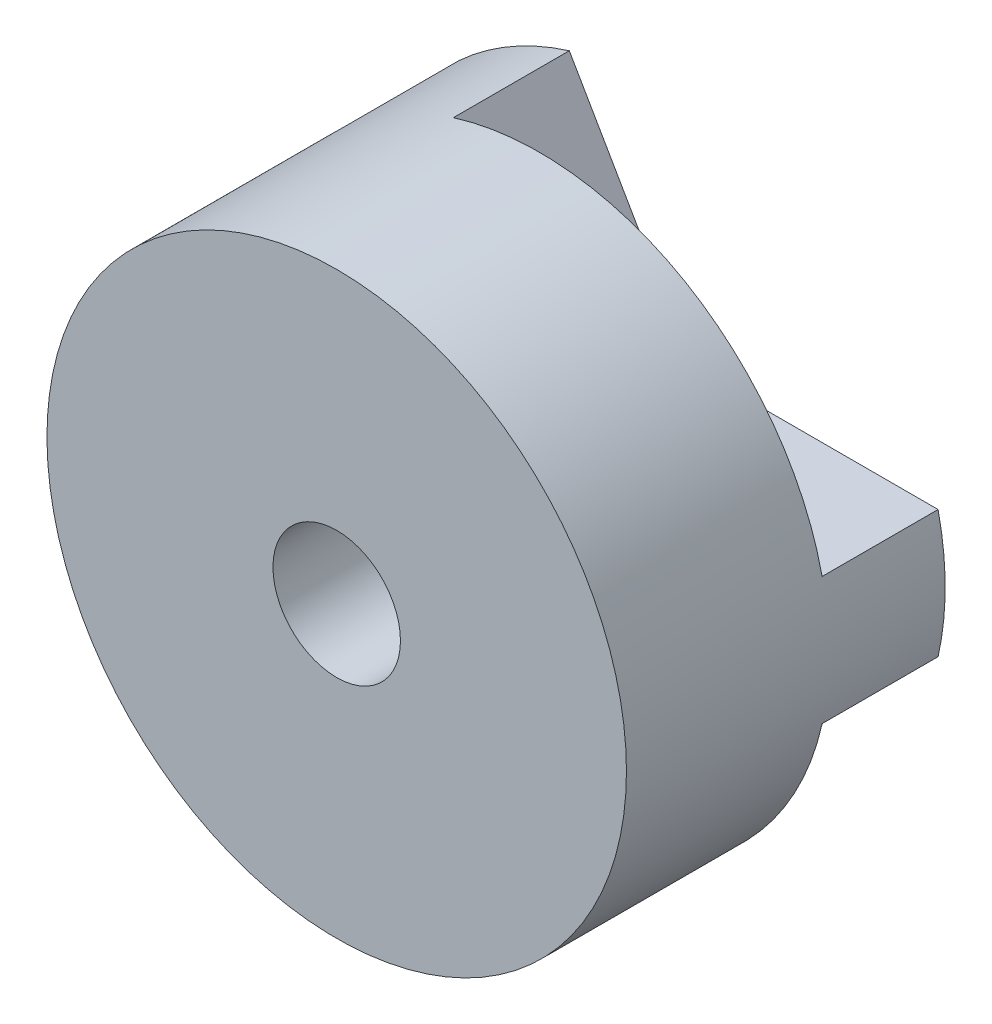
ISO-10303-21;
HEADER;
FILE_DESCRIPTION(('STEP AP214'),'2;1');
FILE_NAME('part.step','',(''),(''),'','','');
FILE_SCHEMA(('AUTOMOTIVE_DESIGN { 1 0 10303 214 1 1 1 1 }'));
ENDSEC;
DATA;
#1=APPLICATION_CONTEXT('core data for automotive mechanical design processes');
#2=APPLICATION_PROTOCOL_DEFINITION('international standard','automotive_design',2000,#1);
#3=PRODUCT_CONTEXT('',#1,'mechanical');
#4=PRODUCT('Part','Part','',(#3));
#5=PRODUCT_RELATED_PRODUCT_CATEGORY('part','',(#4));
#6=PRODUCT_DEFINITION_FORMATION('','',#4);
#7=PRODUCT_DEFINITION_CONTEXT('part definition',#1,'design');
#8=PRODUCT_DEFINITION('design','',#6,#7);
#9=PRODUCT_DEFINITION_SHAPE('','',#8);
#10=(LENGTH_UNIT() NAMED_UNIT(*) SI_UNIT(.MILLI.,.METRE.));
#11=(NAMED_UNIT(*) PLANE_ANGLE_UNIT() SI_UNIT($,.RADIAN.));
#12=(NAMED_UNIT(*) SI_UNIT($,.STERADIAN.) SOLID_ANGLE_UNIT());
#13=UNCERTAINTY_MEASURE_WITH_UNIT(LENGTH_MEASURE(1.E-05),#10,'distance_accuracy_value','');
#14=(GEOMETRIC_REPRESENTATION_CONTEXT(3) GLOBAL_UNCERTAINTY_ASSIGNED_CONTEXT((#13)) GLOBAL_UNIT_ASSIGNED_CONTEXT((#10,
#11,#12)) REPRESENTATION_CONTEXT('',''));
#15=CARTESIAN_POINT('',(0.,0.,0.));
#16=DIRECTION('',(0.,0.,1.));
#17=DIRECTION('',(1.,0.,0.));
#18=AXIS2_PLACEMENT_3D('',#15,#16,#17);
#19=CARTESIAN_POINT('',(0.,0.,0.));
#20=DIRECTION('',(0.,0.,1.));
#21=DIRECTION('',(1.,0.,0.));
#22=AXIS2_PLACEMENT_3D('',#19,#20,#21);
#23=PLANE('',#22);
#24=CARTESIAN_POINT('',(0.,0.,0.));
#25=DIRECTION('',(0.,0.,1.));
#26=DIRECTION('',(1.,0.,0.));
#27=AXIS2_PLACEMENT_3D('',#24,#25,#26);
#28=CIRCLE('',#27,50.);
#29=CARTESIAN_POINT('',(-33.913776238143,-36.7403835209864,0.));
#30=VERTEX_POINT('',#29);
#31=CARTESIAN_POINT('',(-14.8612173548839,-47.7403835209867,0.));
#32=VERTEX_POINT('',#31);
#33=EDGE_CURVE('E155',#30,#32,#28,.T.);
#34=ORIENTED_EDGE('',*,*,#33,.F.);
#35=DIRECTION('',(-0.499999999999983,-0.866025403784448,0.));
#36=VECTOR('',#35,1.);
#37=CARTESIAN_POINT('',(-33.913776238143,-36.7403835209864,0.));
#38=LINE('',#37,#36);
#39=CARTESIAN_POINT('',(-18.0990171775731,-9.34841731861795,0.));
#40=VERTEX_POINT('',#39);
#41=EDGE_CURVE('E100',#40,#30,#38,.T.);
#42=ORIENTED_EDGE('',*,*,#41,.F.);
#43=CARTESIAN_POINT('',(0.,0.,0.));
#44=DIRECTION('',(0.,0.,-1.));
#45=DIRECTION('',(-1.,0.,0.));
#46=AXIS2_PLACEMENT_3D('',#43,#44,#45);
#47=CIRCLE('',#46,20.3707468973801);
#48=CARTESIAN_POINT('',(0.953541705686563,-20.3484173186181,0.));
#49=VERTEX_POINT('',#48);
#50=EDGE_CURVE('E213',#49,#40,#47,.T.);
#51=ORIENTED_EDGE('',*,*,#50,.F.);
#52=DIRECTION('',(0.499999999999995,0.866025403784442,0.));
#53=VECTOR('',#52,1.);
#54=CARTESIAN_POINT('',(-14.8612173548839,-47.7403835209867,0.));
#55=LINE('',#54,#53);
#56=EDGE_CURVE('E211',#32,#49,#55,.T.);
#57=ORIENTED_EDGE('',*,*,#56,.F.);
#58=EDGE_LOOP('',(#34,#42,#51,#57));
#59=FACE_BOUND('',#58,.T.);
#60=ADVANCED_FACE('F32',(#59),#23,.F.);
#61=CARTESIAN_POINT('',(48.7749935930288,-11.0000000000001,0.));
#62=VERTEX_POINT('',#61);
#63=CARTESIAN_POINT('',(48.7749935930285,11.0000000000015,0.));
#64=VERTEX_POINT('',#63);
#65=EDGE_CURVE('E179',#62,#64,#28,.T.);
#66=ORIENTED_EDGE('',*,*,#65,.F.);
#67=DIRECTION('',(1.,0.,0.));
#68=VECTOR('',#67,1.);
#69=CARTESIAN_POINT('',(48.7749935930288,-11.0000000000001,0.));
#70=LINE('',#69,#68);
#71=CARTESIAN_POINT('',(17.145475471888,-11.0000000000004,0.));
#72=VERTEX_POINT('',#71);
#73=EDGE_CURVE('E209',#72,#62,#70,.T.);
#74=ORIENTED_EDGE('',*,*,#73,.F.);
#75=CARTESIAN_POINT('',(0.,0.,0.));
#76=DIRECTION('',(0.,0.,-1.));
#77=DIRECTION('',(-1.,0.,0.));
#78=AXIS2_PLACEMENT_3D('',#75,#76,#77);
#79=CIRCLE('',#78,20.3707468973801);
#80=CARTESIAN_POINT('',(17.1454754718873,11.0000000000015,0.));
#81=VERTEX_POINT('',#80);
#82=EDGE_CURVE('E206',#81,#72,#79,.T.);
#83=ORIENTED_EDGE('',*,*,#82,.F.);
#84=DIRECTION('',(-1.,0.,0.));
#85=VECTOR('',#84,1.);
#86=CARTESIAN_POINT('',(48.7749935930285,11.0000000000015,0.));
#87=LINE('',#86,#85);
#88=EDGE_CURVE('E203',#64,#81,#87,.T.);
#89=ORIENTED_EDGE('',*,*,#88,.F.);
#90=EDGE_LOOP('',(#66,#74,#83,#89));
#91=FACE_BOUND('',#90,.T.);
#92=ADVANCED_FACE('F223',(#91),#23,.F.);
#93=CARTESIAN_POINT('',(0.,0.,55.));
#94=DIRECTION('',(0.,0.,-1.));
#95=DIRECTION('',(-1.,0.,0.));
#96=AXIS2_PLACEMENT_3D('',#93,#94,#95);
#97=CYLINDRICAL_SURFACE('',#96,11.);
#98=CARTESIAN_POINT('',(0.,0.,55.));
#99=DIRECTION('',(0.,0.,1.));
#100=DIRECTION('',(1.,0.,0.));
#101=AXIS2_PLACEMENT_3D('',#98,#99,#100);
#102=CIRCLE('',#101,11.);
#103=CARTESIAN_POINT('',(11.,0.,55.));
#104=VERTEX_POINT('',#103);
#105=EDGE_CURVE('E177',#104,#104,#102,.T.);
#106=ORIENTED_EDGE('',*,*,#105,.T.);
#107=EDGE_LOOP('',(#106));
#108=FACE_BOUND('',#107,.T.);
#109=CARTESIAN_POINT('',(0.,0.,20.));
#110=DIRECTION('',(0.,0.,-1.));
#111=DIRECTION('',(-1.,0.,0.));
#112=AXIS2_PLACEMENT_3D('',#109,#110,#111);
#113=CIRCLE('',#112,11.);
#114=CARTESIAN_POINT('',(-11.,0.,20.));
#115=VERTEX_POINT('',#114);
#116=EDGE_CURVE('E36',#115,#115,#113,.T.);
#117=ORIENTED_EDGE('',*,*,#116,.T.);
#118=EDGE_LOOP('',(#117));
#119=FACE_BOUND('',#118,.T.);
#120=ADVANCED_FACE('F227',(#108,#119),#97,.F.);
#121=CARTESIAN_POINT('',(0.,0.,55.));
#122=DIRECTION('',(0.,0.,1.));
#123=DIRECTION('',(1.,0.,0.));
#124=AXIS2_PLACEMENT_3D('',#121,#122,#123);
#125=PLANE('',#124);
#126=CARTESIAN_POINT('',(0.,0.,55.));
#127=DIRECTION('',(0.,0.,1.));
#128=DIRECTION('',(1.,0.,0.));
#129=AXIS2_PLACEMENT_3D('',#126,#127,#128);
#130=CIRCLE('',#129,50.);
#131=CARTESIAN_POINT('',(50.,0.,55.));
#132=VERTEX_POINT('',#131);
#133=EDGE_CURVE('E11',#132,#132,#130,.T.);
#134=ORIENTED_EDGE('',*,*,#133,.T.);
#135=EDGE_LOOP('',(#134));
#136=FACE_BOUND('',#135,.T.);
#137=ORIENTED_EDGE('',*,*,#105,.F.);
#138=EDGE_LOOP('',(#137));
#139=FACE_BOUND('',#138,.T.);
#140=ADVANCED_FACE('F231',(#136,#139),#125,.T.);
#141=CARTESIAN_POINT('',(-14.8612173548857,47.7403835209861,0.));
#142=VERTEX_POINT('',#141);
#143=CARTESIAN_POINT('',(-33.9137762381444,36.7403835209851,0.));
#144=VERTEX_POINT('',#143);
#145=EDGE_CURVE('E41',#142,#144,#28,.T.);
#146=ORIENTED_EDGE('',*,*,#145,.F.);
#147=DIRECTION('',(-0.500000000000012,0.866025403784431,0.));
#148=VECTOR('',#147,1.);
#149=CARTESIAN_POINT('',(-14.8612173548857,47.7403835209861,0.));
#150=LINE('',#149,#148);
#151=CARTESIAN_POINT('',(0.953541705685063,20.3484173186182,0.));
#152=VERTEX_POINT('',#151);
#153=EDGE_CURVE('E192',#152,#142,#150,.T.);
#154=ORIENTED_EDGE('',*,*,#153,.F.);
#155=CARTESIAN_POINT('',(0.,0.,0.));
#156=DIRECTION('',(0.,0.,-1.));
#157=DIRECTION('',(-1.,0.,0.));
#158=AXIS2_PLACEMENT_3D('',#155,#156,#157);
#159=CIRCLE('',#158,20.3707468973801);
#160=CARTESIAN_POINT('',(-18.0990171775738,9.34841731861664,0.));
#161=VERTEX_POINT('',#160);
#162=EDGE_CURVE('E196',#161,#152,#159,.T.);
#163=ORIENTED_EDGE('',*,*,#162,.F.);
#164=DIRECTION('',(0.5,-0.866025403784439,0.));
#165=VECTOR('',#164,1.);
#166=CARTESIAN_POINT('',(-33.9137762381444,36.7403835209851,0.));
#167=LINE('',#166,#165);
#168=EDGE_CURVE('E194',#144,#161,#167,.T.);
#169=ORIENTED_EDGE('',*,*,#168,.F.);
#170=EDGE_LOOP('',(#146,#154,#163,#169));
#171=FACE_BOUND('',#170,.T.);
#172=ADVANCED_FACE('F190',(#171),#23,.F.);
#173=CARTESIAN_POINT('',(0.,0.,55.));
#174=DIRECTION('',(0.,0.,-1.));
#175=DIRECTION('',(-1.,0.,0.));
#176=AXIS2_PLACEMENT_3D('',#173,#174,#175);
#177=CYLINDRICAL_SURFACE('',#176,50.);
#178=ORIENTED_EDGE('',*,*,#65,.T.);
#179=DIRECTION('',(0.,0.,-1.));
#180=VECTOR('',#179,1.);
#181=CARTESIAN_POINT('',(48.7749935930285,11.0000000000015,20.));
#182=LINE('',#181,#180);
#183=CARTESIAN_POINT('',(48.7749935930285,11.0000000000015,20.));
#184=VERTEX_POINT('',#183);
#185=EDGE_CURVE('E166',#184,#64,#182,.T.);
#186=ORIENTED_EDGE('',*,*,#185,.F.);
#187=CARTESIAN_POINT('',(0.,0.,20.));
#188=DIRECTION('',(0.,0.,-1.));
#189=DIRECTION('',(-1.,0.,0.));
#190=AXIS2_PLACEMENT_3D('',#187,#188,#189);
#191=CIRCLE('',#190,50.);
#192=CARTESIAN_POINT('',(-14.8612173548857,47.7403835209861,20.));
#193=VERTEX_POINT('',#192);
#194=EDGE_CURVE('E381',#193,#184,#191,.T.);
#195=ORIENTED_EDGE('',*,*,#194,.F.);
#196=DIRECTION('',(0.,0.,-1.));
#197=VECTOR('',#196,1.);
#198=CARTESIAN_POINT('',(-14.8612173548857,47.7403835209861,20.));
#199=LINE('',#198,#197);
#200=EDGE_CURVE('E168',#193,#142,#199,.T.);
#201=ORIENTED_EDGE('',*,*,#200,.T.);
#202=ORIENTED_EDGE('',*,*,#145,.T.);
#203=DIRECTION('',(0.,0.,-1.));
#204=VECTOR('',#203,1.);
#205=CARTESIAN_POINT('',(-33.9137762381444,36.7403835209851,20.));
#206=LINE('',#205,#204);
#207=CARTESIAN_POINT('',(-33.9137762381444,36.7403835209851,20.));
#208=VERTEX_POINT('',#207);
#209=EDGE_CURVE('E175',#208,#144,#206,.T.);
#210=ORIENTED_EDGE('',*,*,#209,.F.);
#211=CARTESIAN_POINT('',(0.,0.,20.));
#212=DIRECTION('',(0.,0.,-1.));
#213=DIRECTION('',(-1.,0.,0.));
#214=AXIS2_PLACEMENT_3D('',#211,#212,#213);
#215=CIRCLE('',#214,50.);
#216=CARTESIAN_POINT('',(-33.913776238143,-36.7403835209864,20.));
#217=VERTEX_POINT('',#216);
#218=EDGE_CURVE('E216',#217,#208,#215,.T.);
#219=ORIENTED_EDGE('',*,*,#218,.F.);
#220=DIRECTION('',(0.,0.,-1.));
#221=VECTOR('',#220,1.);
#222=CARTESIAN_POINT('',(-33.913776238143,-36.7403835209864,20.));
#223=LINE('',#222,#221);
#224=EDGE_CURVE('E217',#217,#30,#223,.T.);
#225=ORIENTED_EDGE('',*,*,#224,.T.);
#226=ORIENTED_EDGE('',*,*,#33,.T.);
#227=DIRECTION('',(0.,0.,-1.));
#228=VECTOR('',#227,1.);
#229=CARTESIAN_POINT('',(-14.8612173548839,-47.7403835209867,20.));
#230=LINE('',#229,#228);
#231=CARTESIAN_POINT('',(-14.8612173548839,-47.7403835209867,20.));
#232=VERTEX_POINT('',#231);
#233=EDGE_CURVE('E136',#232,#32,#230,.T.);
#234=ORIENTED_EDGE('',*,*,#233,.F.);
#235=CARTESIAN_POINT('',(0.,0.,20.));
#236=DIRECTION('',(0.,0.,-1.));
#237=DIRECTION('',(-1.,0.,0.));
#238=AXIS2_PLACEMENT_3D('',#235,#236,#237);
#239=CIRCLE('',#238,50.);
#240=CARTESIAN_POINT('',(48.7749935930288,-11.0000000000001,20.));
#241=VERTEX_POINT('',#240);
#242=EDGE_CURVE('E140',#241,#232,#239,.T.);
#243=ORIENTED_EDGE('',*,*,#242,.F.);
#244=DIRECTION('',(0.,0.,-1.));
#245=VECTOR('',#244,1.);
#246=CARTESIAN_POINT('',(48.7749935930288,-11.0000000000001,20.));
#247=LINE('',#246,#245);
#248=EDGE_CURVE('E156',#241,#62,#247,.T.);
#249=ORIENTED_EDGE('',*,*,#248,.T.);
#250=EDGE_LOOP('',(#178,#186,#195,#201,#202,#210,#219,#225,#226,#234,#243,#249));
#251=FACE_BOUND('',#250,.T.);
#252=ORIENTED_EDGE('',*,*,#133,.F.);
#253=EDGE_LOOP('',(#252));
#254=FACE_BOUND('',#253,.T.);
#255=ADVANCED_FACE('F34',(#251,#254),#177,.T.);
#256=CARTESIAN_POINT('',(-33.913776238143,-36.7403835209864,20.));
#257=DIRECTION('',(0.866025403784448,-0.499999999999983,0.));
#258=DIRECTION('',(0.499999999999983,0.866025403784448,0.));
#259=AXIS2_PLACEMENT_3D('',#256,#257,#258);
#260=PLANE('',#259);
#261=ORIENTED_EDGE('',*,*,#41,.T.);
#262=ORIENTED_EDGE('',*,*,#224,.F.);
#263=DIRECTION('',(-0.499999999999983,-0.866025403784448,0.));
#264=VECTOR('',#263,1.);
#265=CARTESIAN_POINT('',(-33.913776238143,-36.7403835209864,20.));
#266=LINE('',#265,#264);
#267=CARTESIAN_POINT('',(-18.0990171775731,-9.34841731861795,20.));
#268=VERTEX_POINT('',#267);
#269=EDGE_CURVE('E49',#268,#217,#266,.T.);
#270=ORIENTED_EDGE('',*,*,#269,.F.);
#271=DIRECTION('',(0.,0.,-1.));
#272=VECTOR('',#271,1.);
#273=CARTESIAN_POINT('',(-18.0990171775731,-9.34841731861795,20.));
#274=LINE('',#273,#272);
#275=EDGE_CURVE('E58',#268,#40,#274,.T.);
#276=ORIENTED_EDGE('',*,*,#275,.T.);
#277=EDGE_LOOP('',(#261,#262,#270,#276));
#278=FACE_BOUND('',#277,.T.);
#279=ADVANCED_FACE('F218',(#278),#260,.F.);
#280=CARTESIAN_POINT('',(0.,0.,20.));
#281=DIRECTION('',(0.,0.,-1.));
#282=DIRECTION('',(-1.,0.,0.));
#283=AXIS2_PLACEMENT_3D('',#280,#281,#282);
#284=CYLINDRICAL_SURFACE('',#283,20.3707468973801);
#285=ORIENTED_EDGE('',*,*,#50,.T.);
#286=ORIENTED_EDGE('',*,*,#275,.F.);
#287=CARTESIAN_POINT('',(0.,0.,20.));
#288=DIRECTION('',(0.,0.,-1.));
#289=DIRECTION('',(-1.,0.,0.));
#290=AXIS2_PLACEMENT_3D('',#287,#288,#289);
#291=CIRCLE('',#290,20.3707468973801);
#292=CARTESIAN_POINT('',(0.953541705686563,-20.3484173186181,20.));
#293=VERTEX_POINT('',#292);
#294=EDGE_CURVE('E139',#293,#268,#291,.T.);
#295=ORIENTED_EDGE('',*,*,#294,.F.);
#296=DIRECTION('',(0.,0.,-1.));
#297=VECTOR('',#296,1.);
#298=CARTESIAN_POINT('',(0.953541705686563,-20.3484173186181,20.));
#299=LINE('',#298,#297);
#300=EDGE_CURVE('E138',#293,#49,#299,.T.);
#301=ORIENTED_EDGE('',*,*,#300,.T.);
#302=EDGE_LOOP('',(#285,#286,#295,#301));
#303=FACE_BOUND('',#302,.T.);
#304=ADVANCED_FACE('F220',(#303),#284,.F.);
#305=CARTESIAN_POINT('',(-14.8612173548839,-47.7403835209867,20.));
#306=DIRECTION('',(-0.866025403784442,0.499999999999995,0.));
#307=DIRECTION('',(-0.499999999999995,-0.866025403784442,0.));
#308=AXIS2_PLACEMENT_3D('',#305,#306,#307);
#309=PLANE('',#308);
#310=ORIENTED_EDGE('',*,*,#56,.T.);
#311=ORIENTED_EDGE('',*,*,#300,.F.);
#312=DIRECTION('',(0.499999999999995,0.866025403784442,0.));
#313=VECTOR('',#312,1.);
#314=CARTESIAN_POINT('',(-14.8612173548839,-47.7403835209867,20.));
#315=LINE('',#314,#313);
#316=EDGE_CURVE('E131',#232,#293,#315,.T.);
#317=ORIENTED_EDGE('',*,*,#316,.F.);
#318=ORIENTED_EDGE('',*,*,#233,.T.);
#319=EDGE_LOOP('',(#310,#311,#317,#318));
#320=FACE_BOUND('',#319,.T.);
#321=ADVANCED_FACE('F134',(#320),#309,.F.);
#322=CARTESIAN_POINT('',(48.7749935930288,-11.0000000000001,20.));
#323=DIRECTION('',(0.,1.,0.));
#324=DIRECTION('',(-1.,0.,0.));
#325=AXIS2_PLACEMENT_3D('',#322,#323,#324);
#326=PLANE('',#325);
#327=ORIENTED_EDGE('',*,*,#73,.T.);
#328=ORIENTED_EDGE('',*,*,#248,.F.);
#329=DIRECTION('',(1.,0.,0.));
#330=VECTOR('',#329,1.);
#331=CARTESIAN_POINT('',(48.7749935930288,-11.0000000000001,20.));
#332=LINE('',#331,#330);
#333=CARTESIAN_POINT('',(17.145475471888,-11.0000000000004,20.));
#334=VERTEX_POINT('',#333);
#335=EDGE_CURVE('E147',#334,#241,#332,.T.);
#336=ORIENTED_EDGE('',*,*,#335,.F.);
#337=DIRECTION('',(0.,0.,-1.));
#338=VECTOR('',#337,1.);
#339=CARTESIAN_POINT('',(17.145475471888,-11.0000000000004,20.));
#340=LINE('',#339,#338);
#341=EDGE_CURVE('E159',#334,#72,#340,.T.);
#342=ORIENTED_EDGE('',*,*,#341,.T.);
#343=EDGE_LOOP('',(#327,#328,#336,#342));
#344=FACE_BOUND('',#343,.T.);
#345=ADVANCED_FACE('F262',(#344),#326,.F.);
#346=CARTESIAN_POINT('',(0.,0.,20.));
#347=DIRECTION('',(0.,0.,-1.));
#348=DIRECTION('',(-1.,0.,0.));
#349=AXIS2_PLACEMENT_3D('',#346,#347,#348);
#350=CYLINDRICAL_SURFACE('',#349,20.3707468973801);
#351=ORIENTED_EDGE('',*,*,#82,.T.);
#352=ORIENTED_EDGE('',*,*,#341,.F.);
#353=CARTESIAN_POINT('',(0.,0.,20.));
#354=DIRECTION('',(0.,0.,-1.));
#355=DIRECTION('',(-1.,0.,0.));
#356=AXIS2_PLACEMENT_3D('',#353,#354,#355);
#357=CIRCLE('',#356,20.3707468973801);
#358=CARTESIAN_POINT('',(17.1454754718873,11.0000000000015,20.));
#359=VERTEX_POINT('',#358);
#360=EDGE_CURVE('E385',#359,#334,#357,.T.);
#361=ORIENTED_EDGE('',*,*,#360,.F.);
#362=DIRECTION('',(0.,0.,-1.));
#363=VECTOR('',#362,1.);
#364=CARTESIAN_POINT('',(17.1454754718873,11.0000000000015,20.));
#365=LINE('',#364,#363);
#366=EDGE_CURVE('E164',#359,#81,#365,.T.);
#367=ORIENTED_EDGE('',*,*,#366,.T.);
#368=EDGE_LOOP('',(#351,#352,#361,#367));
#369=FACE_BOUND('',#368,.T.);
#370=ADVANCED_FACE('F258',(#369),#350,.F.);
#371=CARTESIAN_POINT('',(48.7749935930285,11.0000000000015,20.));
#372=DIRECTION('',(0.,-1.,0.));
#373=DIRECTION('',(1.,0.,0.));
#374=AXIS2_PLACEMENT_3D('',#371,#372,#373);
#375=PLANE('',#374);
#376=ORIENTED_EDGE('',*,*,#88,.T.);
#377=ORIENTED_EDGE('',*,*,#366,.F.);
#378=DIRECTION('',(-1.,0.,0.));
#379=VECTOR('',#378,1.);
#380=CARTESIAN_POINT('',(48.7749935930285,11.0000000000015,20.));
#381=LINE('',#380,#379);
#382=EDGE_CURVE('E379',#184,#359,#381,.T.);
#383=ORIENTED_EDGE('',*,*,#382,.F.);
#384=ORIENTED_EDGE('',*,*,#185,.T.);
#385=EDGE_LOOP('',(#376,#377,#383,#384));
#386=FACE_BOUND('',#385,.T.);
#387=ADVANCED_FACE('F254',(#386),#375,.F.);
#388=CARTESIAN_POINT('',(-14.8612173548857,47.7403835209861,20.));
#389=DIRECTION('',(-0.866025403784431,-0.500000000000012,0.));
#390=DIRECTION('',(0.500000000000012,-0.866025403784431,0.));
#391=AXIS2_PLACEMENT_3D('',#388,#389,#390);
#392=PLANE('',#391);
#393=ORIENTED_EDGE('',*,*,#153,.T.);
#394=ORIENTED_EDGE('',*,*,#200,.F.);
#395=DIRECTION('',(-0.500000000000012,0.866025403784431,0.));
#396=VECTOR('',#395,1.);
#397=CARTESIAN_POINT('',(-14.8612173548857,47.7403835209861,20.));
#398=LINE('',#397,#396);
#399=CARTESIAN_POINT('',(0.953541705685063,20.3484173186182,20.));
#400=VERTEX_POINT('',#399);
#401=EDGE_CURVE('E383',#400,#193,#398,.T.);
#402=ORIENTED_EDGE('',*,*,#401,.F.);
#403=DIRECTION('',(0.,0.,-1.));
#404=VECTOR('',#403,1.);
#405=CARTESIAN_POINT('',(0.953541705685063,20.3484173186182,20.));
#406=LINE('',#405,#404);
#407=EDGE_CURVE('E171',#400,#152,#406,.T.);
#408=ORIENTED_EDGE('',*,*,#407,.T.);
#409=EDGE_LOOP('',(#393,#394,#402,#408));
#410=FACE_BOUND('',#409,.T.);
#411=ADVANCED_FACE('F250',(#410),#392,.F.);
#412=CARTESIAN_POINT('',(0.,0.,20.));
#413=DIRECTION('',(0.,0.,-1.));
#414=DIRECTION('',(-1.,0.,0.));
#415=AXIS2_PLACEMENT_3D('',#412,#413,#414);
#416=CYLINDRICAL_SURFACE('',#415,20.3707468973801);
#417=ORIENTED_EDGE('',*,*,#162,.T.);
#418=ORIENTED_EDGE('',*,*,#407,.F.);
#419=CARTESIAN_POINT('',(0.,0.,20.));
#420=DIRECTION('',(0.,0.,-1.));
#421=DIRECTION('',(-1.,0.,0.));
#422=AXIS2_PLACEMENT_3D('',#419,#420,#421);
#423=CIRCLE('',#422,20.3707468973801);
#424=CARTESIAN_POINT('',(-18.0990171775738,9.34841731861664,20.));
#425=VERTEX_POINT('',#424);
#426=EDGE_CURVE('E387',#425,#400,#423,.T.);
#427=ORIENTED_EDGE('',*,*,#426,.F.);
#428=DIRECTION('',(0.,0.,-1.));
#429=VECTOR('',#428,1.);
#430=CARTESIAN_POINT('',(-18.0990171775738,9.34841731861664,20.));
#431=LINE('',#430,#429);
#432=EDGE_CURVE('E173',#425,#161,#431,.T.);
#433=ORIENTED_EDGE('',*,*,#432,.T.);
#434=EDGE_LOOP('',(#417,#418,#427,#433));
#435=FACE_BOUND('',#434,.T.);
#436=ADVANCED_FACE('F247',(#435),#416,.F.);
#437=CARTESIAN_POINT('',(-33.9137762381444,36.7403835209851,20.));
#438=DIRECTION('',(0.866025403784439,0.5,0.));
#439=DIRECTION('',(-0.5,0.866025403784439,0.));
#440=AXIS2_PLACEMENT_3D('',#437,#438,#439);
#441=PLANE('',#440);
#442=ORIENTED_EDGE('',*,*,#168,.T.);
#443=ORIENTED_EDGE('',*,*,#432,.F.);
#444=DIRECTION('',(0.5,-0.866025403784439,0.));
#445=VECTOR('',#444,1.);
#446=CARTESIAN_POINT('',(-33.9137762381444,36.7403835209851,20.));
#447=LINE('',#446,#445);
#448=EDGE_CURVE('E108',#208,#425,#447,.T.);
#449=ORIENTED_EDGE('',*,*,#448,.F.);
#450=ORIENTED_EDGE('',*,*,#209,.T.);
#451=EDGE_LOOP('',(#442,#443,#449,#450));
#452=FACE_BOUND('',#451,.T.);
#453=ADVANCED_FACE('F244',(#452),#441,.F.);
#454=CARTESIAN_POINT('',(0.,0.,20.));
#455=DIRECTION('',(0.,0.,-1.));
#456=DIRECTION('',(-1.,0.,0.));
#457=AXIS2_PLACEMENT_3D('',#454,#455,#456);
#458=PLANE('',#457);
#459=ORIENTED_EDGE('',*,*,#116,.F.);
#460=EDGE_LOOP('',(#459));
#461=FACE_BOUND('',#460,.T.);
#462=ORIENTED_EDGE('',*,*,#218,.T.);
#463=ORIENTED_EDGE('',*,*,#448,.T.);
#464=ORIENTED_EDGE('',*,*,#426,.T.);
#465=ORIENTED_EDGE('',*,*,#401,.T.);
#466=ORIENTED_EDGE('',*,*,#194,.T.);
#467=ORIENTED_EDGE('',*,*,#382,.T.);
#468=ORIENTED_EDGE('',*,*,#360,.T.);
#469=ORIENTED_EDGE('',*,*,#335,.T.);
#470=ORIENTED_EDGE('',*,*,#242,.T.);
#471=ORIENTED_EDGE('',*,*,#316,.T.);
#472=ORIENTED_EDGE('',*,*,#294,.T.);
#473=ORIENTED_EDGE('',*,*,#269,.T.);
#474=EDGE_LOOP('',(#462,#463,#464,#465,#466,#467,#468,#469,#470,#471,#472,#473));
#475=FACE_BOUND('',#474,.T.);
#476=ADVANCED_FACE('F144',(#461,#475),#458,.T.);
#477=CLOSED_SHELL('',(#60,#92,#120,#140,#172,#255,#279,#304,#321,#345,#370,#387,#411,#436,#453,#476));
#478=MANIFOLD_SOLID_BREP('B2',#477);
#479=ADVANCED_BREP_SHAPE_REPRESENTATION('',(#18,#478),#14);
#480=SHAPE_DEFINITION_REPRESENTATION(#9,#479);
ENDSEC;
END-ISO-10303-21;
